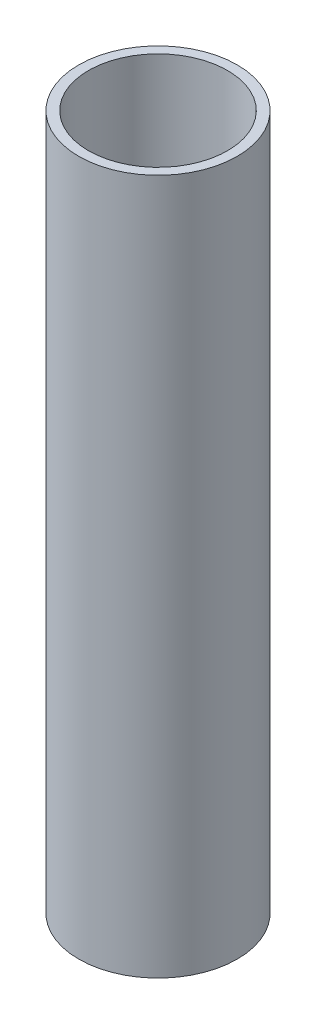
ISO-10303-21;
HEADER;
FILE_DESCRIPTION(('STEP AP214'),'2;1');
FILE_NAME('part.step','',(''),(''),'','','');
FILE_SCHEMA(('AUTOMOTIVE_DESIGN { 1 0 10303 214 1 1 1 1 }'));
ENDSEC;
DATA;
#1=APPLICATION_CONTEXT('core data for automotive mechanical design processes');
#2=APPLICATION_PROTOCOL_DEFINITION('international standard','automotive_design',2000,#1);
#3=PRODUCT_CONTEXT('',#1,'mechanical');
#4=PRODUCT('Part','Part','',(#3));
#5=PRODUCT_RELATED_PRODUCT_CATEGORY('part','',(#4));
#6=PRODUCT_DEFINITION_FORMATION('','',#4);
#7=PRODUCT_DEFINITION_CONTEXT('part definition',#1,'design');
#8=PRODUCT_DEFINITION('design','',#6,#7);
#9=PRODUCT_DEFINITION_SHAPE('','',#8);
#10=(LENGTH_UNIT() NAMED_UNIT(*) SI_UNIT(.MILLI.,.METRE.));
#11=(NAMED_UNIT(*) PLANE_ANGLE_UNIT() SI_UNIT($,.RADIAN.));
#12=(NAMED_UNIT(*) SI_UNIT($,.STERADIAN.) SOLID_ANGLE_UNIT());
#13=UNCERTAINTY_MEASURE_WITH_UNIT(LENGTH_MEASURE(1.E-05),#10,'distance_accuracy_value','');
#14=(GEOMETRIC_REPRESENTATION_CONTEXT(3) GLOBAL_UNCERTAINTY_ASSIGNED_CONTEXT((#13)) GLOBAL_UNIT_ASSIGNED_CONTEXT((#10,
#11,#12)) REPRESENTATION_CONTEXT('',''));
#15=CARTESIAN_POINT('',(0.,0.,0.));
#16=DIRECTION('',(0.,0.,1.));
#17=DIRECTION('',(1.,0.,0.));
#18=AXIS2_PLACEMENT_3D('',#15,#16,#17);
#19=CARTESIAN_POINT('',(0.,127.,0.));
#20=DIRECTION('',(0.,1.,0.));
#21=DIRECTION('',(0.,0.,1.));
#22=AXIS2_PLACEMENT_3D('',#19,#20,#21);
#23=PLANE('',#22);
#24=CARTESIAN_POINT('',(0.,127.,0.));
#25=DIRECTION('',(0.,1.,0.));
#26=DIRECTION('',(0.,0.,1.));
#27=AXIS2_PLACEMENT_3D('',#24,#25,#26);
#28=CIRCLE('',#27,14.478);
#29=CARTESIAN_POINT('',(0.,127.,14.478));
#30=VERTEX_POINT('',#29);
#31=EDGE_CURVE('E10',#30,#30,#28,.T.);
#32=ORIENTED_EDGE('',*,*,#31,.T.);
#33=EDGE_LOOP('',(#32));
#34=FACE_BOUND('',#33,.T.);
#35=CARTESIAN_POINT('',(0.,127.,0.));
#36=DIRECTION('',(0.,1.,0.));
#37=DIRECTION('',(0.,0.,1.));
#38=AXIS2_PLACEMENT_3D('',#35,#36,#37);
#39=CIRCLE('',#38,12.7);
#40=CARTESIAN_POINT('',(0.,127.,12.7));
#41=VERTEX_POINT('',#40);
#42=EDGE_CURVE('E45',#41,#41,#39,.T.);
#43=ORIENTED_EDGE('',*,*,#42,.F.);
#44=EDGE_LOOP('',(#43));
#45=FACE_BOUND('',#44,.T.);
#46=ADVANCED_FACE('F34',(#34,#45),#23,.T.);
#47=CARTESIAN_POINT('',(0.,0.,0.));
#48=DIRECTION('',(0.,1.,0.));
#49=DIRECTION('',(0.,0.,1.));
#50=AXIS2_PLACEMENT_3D('',#47,#48,#49);
#51=PLANE('',#50);
#52=CARTESIAN_POINT('',(0.,0.,0.));
#53=DIRECTION('',(0.,1.,0.));
#54=DIRECTION('',(0.,0.,1.));
#55=AXIS2_PLACEMENT_3D('',#52,#53,#54);
#56=CIRCLE('',#55,14.478);
#57=CARTESIAN_POINT('',(0.,0.,14.478));
#58=VERTEX_POINT('',#57);
#59=EDGE_CURVE('E38',#58,#58,#56,.T.);
#60=ORIENTED_EDGE('',*,*,#59,.F.);
#61=EDGE_LOOP('',(#60));
#62=FACE_BOUND('',#61,.T.);
#63=CARTESIAN_POINT('',(0.,0.,0.));
#64=DIRECTION('',(0.,1.,0.));
#65=DIRECTION('',(0.,0.,1.));
#66=AXIS2_PLACEMENT_3D('',#63,#64,#65);
#67=CIRCLE('',#66,12.7);
#68=CARTESIAN_POINT('',(0.,0.,12.7));
#69=VERTEX_POINT('',#68);
#70=EDGE_CURVE('E47',#69,#69,#67,.T.);
#71=ORIENTED_EDGE('',*,*,#70,.T.);
#72=EDGE_LOOP('',(#71));
#73=FACE_BOUND('',#72,.T.);
#74=ADVANCED_FACE('F57',(#62,#73),#51,.F.);
#75=CARTESIAN_POINT('',(0.,127.,0.));
#76=DIRECTION('',(0.,-1.,0.));
#77=DIRECTION('',(0.,0.,-1.));
#78=AXIS2_PLACEMENT_3D('',#75,#76,#77);
#79=CYLINDRICAL_SURFACE('',#78,14.478);
#80=ORIENTED_EDGE('',*,*,#31,.F.);
#81=EDGE_LOOP('',(#80));
#82=FACE_BOUND('',#81,.T.);
#83=ORIENTED_EDGE('',*,*,#59,.T.);
#84=EDGE_LOOP('',(#83));
#85=FACE_BOUND('',#84,.T.);
#86=ADVANCED_FACE('F36',(#82,#85),#79,.T.);
#87=CARTESIAN_POINT('',(0.,127.,0.));
#88=DIRECTION('',(0.,-1.,0.));
#89=DIRECTION('',(0.,0.,-1.));
#90=AXIS2_PLACEMENT_3D('',#87,#88,#89);
#91=CYLINDRICAL_SURFACE('',#90,12.7);
#92=ORIENTED_EDGE('',*,*,#42,.T.);
#93=EDGE_LOOP('',(#92));
#94=FACE_BOUND('',#93,.T.);
#95=ORIENTED_EDGE('',*,*,#70,.F.);
#96=EDGE_LOOP('',(#95));
#97=FACE_BOUND('',#96,.T.);
#98=ADVANCED_FACE('F53',(#94,#97),#91,.F.);
#99=CLOSED_SHELL('',(#46,#74,#86,#98));
#100=MANIFOLD_SOLID_BREP('B2',#99);
#101=ADVANCED_BREP_SHAPE_REPRESENTATION('',(#18,#100),#14);
#102=SHAPE_DEFINITION_REPRESENTATION(#9,#101);
ENDSEC;
END-ISO-10303-21;
